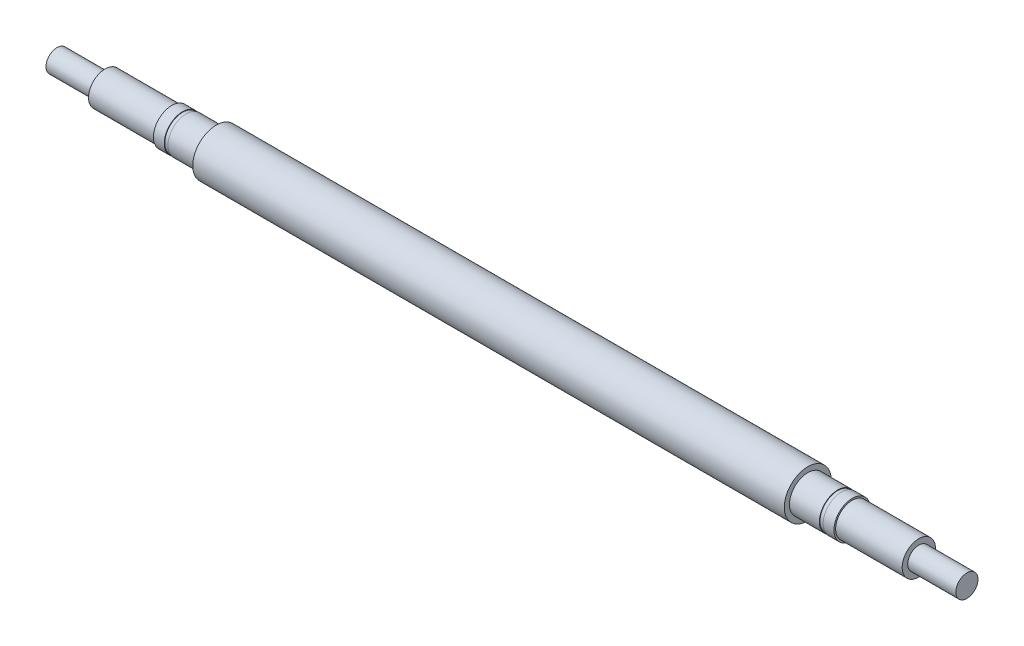
ISO-10303-21;
HEADER;
FILE_DESCRIPTION(('STEP AP214'),'2;1');
FILE_NAME('part.step','',(''),(''),'','','');
FILE_SCHEMA(('AUTOMOTIVE_DESIGN { 1 0 10303 214 1 1 1 1 }'));
ENDSEC;
DATA;
#1=APPLICATION_CONTEXT('core data for automotive mechanical design processes');
#2=APPLICATION_PROTOCOL_DEFINITION('international standard','automotive_design',2000,#1);
#3=PRODUCT_CONTEXT('',#1,'mechanical');
#4=PRODUCT('Part','Part','',(#3));
#5=PRODUCT_RELATED_PRODUCT_CATEGORY('part','',(#4));
#6=PRODUCT_DEFINITION_FORMATION('','',#4);
#7=PRODUCT_DEFINITION_CONTEXT('part definition',#1,'design');
#8=PRODUCT_DEFINITION('design','',#6,#7);
#9=PRODUCT_DEFINITION_SHAPE('','',#8);
#10=(LENGTH_UNIT() NAMED_UNIT(*) SI_UNIT(.MILLI.,.METRE.));
#11=(NAMED_UNIT(*) PLANE_ANGLE_UNIT() SI_UNIT($,.RADIAN.));
#12=(NAMED_UNIT(*) SI_UNIT($,.STERADIAN.) SOLID_ANGLE_UNIT());
#13=UNCERTAINTY_MEASURE_WITH_UNIT(LENGTH_MEASURE(1.E-05),#10,'distance_accuracy_value','');
#14=(GEOMETRIC_REPRESENTATION_CONTEXT(3) GLOBAL_UNCERTAINTY_ASSIGNED_CONTEXT((#13)) GLOBAL_UNIT_ASSIGNED_CONTEXT((#10,
#11,#12)) REPRESENTATION_CONTEXT('',''));
#15=CARTESIAN_POINT('',(0.,0.,0.));
#16=DIRECTION('',(0.,0.,1.));
#17=DIRECTION('',(1.,0.,0.));
#18=AXIS2_PLACEMENT_3D('',#15,#16,#17);
#19=CARTESIAN_POINT('',(123.,0.,-0.0536848982931916));
#20=DIRECTION('',(1.,0.,0.));
#21=DIRECTION('',(0.,0.,-1.));
#22=AXIS2_PLACEMENT_3D('',#19,#20,#21);
#23=CYLINDRICAL_SURFACE('',#22,6.35);
#24=CARTESIAN_POINT('',(-79.976146667179,0.,-0.0536848982931916));
#25=DIRECTION('',(1.,0.,0.));
#26=DIRECTION('',(0.,0.,-1.));
#27=AXIS2_PLACEMENT_3D('',#24,#25,#26);
#28=CIRCLE('',#27,6.35);
#29=CARTESIAN_POINT('',(-79.976146667179,0.,-6.4036848982932));
#30=VERTEX_POINT('',#29);
#31=EDGE_CURVE('E126',#30,#30,#28,.T.);
#32=ORIENTED_EDGE('',*,*,#31,.T.);
#33=EDGE_LOOP('',(#32));
#34=FACE_BOUND('',#33,.T.);
#35=CARTESIAN_POINT('',(79.976146667179,0.,-0.0536848982931916));
#36=DIRECTION('',(1.,0.,0.));
#37=DIRECTION('',(0.,0.,-1.));
#38=AXIS2_PLACEMENT_3D('',#35,#36,#37);
#39=CIRCLE('',#38,6.35);
#40=CARTESIAN_POINT('',(79.976146667179,0.,-6.4036848982932));
#41=VERTEX_POINT('',#40);
#42=EDGE_CURVE('E130',#41,#41,#39,.T.);
#43=ORIENTED_EDGE('',*,*,#42,.F.);
#44=EDGE_LOOP('',(#43));
#45=FACE_BOUND('',#44,.T.);
#46=CARTESIAN_POINT('',(-20.6548637464778,0.,-0.0536848982931916));
#47=DIRECTION('',(1.,0.,0.));
#48=DIRECTION('',(0.,0.,-1.));
#49=AXIS2_PLACEMENT_3D('',#46,#47,#48);
#50=CIRCLE('',#49,6.35);
#51=CARTESIAN_POINT('',(-20.6548637464778,3.50307669676708,-5.35));
#52=VERTEX_POINT('',#51);
#53=CARTESIAN_POINT('',(-20.6548637464778,-3.50307669676708,-5.35));
#54=VERTEX_POINT('',#53);
#55=EDGE_CURVE('E11',#52,#54,#50,.F.);
#56=ORIENTED_EDGE('',*,*,#55,.T.);
#57=DIRECTION('',(1.,0.,0.));
#58=VECTOR('',#57,1.);
#59=CARTESIAN_POINT('',(123.,-3.50307669676707,-5.35));
#60=LINE('',#59,#58);
#61=CARTESIAN_POINT('',(-10.6548637464778,-3.50307669676707,-5.35));
#62=VERTEX_POINT('',#61);
#63=EDGE_CURVE('E72',#54,#62,#60,.T.);
#64=ORIENTED_EDGE('',*,*,#63,.T.);
#65=CARTESIAN_POINT('',(-10.6548637464778,0.,-0.0536848982931916));
#66=DIRECTION('',(-1.,0.,0.));
#67=DIRECTION('',(0.,0.,1.));
#68=AXIS2_PLACEMENT_3D('',#65,#66,#67);
#69=CIRCLE('',#68,6.35);
#70=CARTESIAN_POINT('',(-10.6548637464778,3.50307669676707,-5.35));
#71=VERTEX_POINT('',#70);
#72=EDGE_CURVE('E69',#62,#71,#69,.F.);
#73=ORIENTED_EDGE('',*,*,#72,.T.);
#74=DIRECTION('',(1.,0.,0.));
#75=VECTOR('',#74,1.);
#76=CARTESIAN_POINT('',(123.,3.50307669676707,-5.35));
#77=LINE('',#76,#75);
#78=EDGE_CURVE('E51',#71,#52,#77,.F.);
#79=ORIENTED_EDGE('',*,*,#78,.T.);
#80=EDGE_LOOP('',(#56,#64,#73,#79));
#81=FACE_BOUND('',#80,.T.);
#82=ADVANCED_FACE('F42',(#34,#45,#81),#23,.T.);
#83=CARTESIAN_POINT('',(-123.,0.,-3.05368489829319));
#84=DIRECTION('',(-1.,0.,0.));
#85=DIRECTION('',(0.,0.,1.));
#86=AXIS2_PLACEMENT_3D('',#83,#84,#85);
#87=PLANE('',#86);
#88=CARTESIAN_POINT('',(-123.,0.,-0.0536848982931916));
#89=DIRECTION('',(1.,0.,0.));
#90=DIRECTION('',(0.,0.,-1.));
#91=AXIS2_PLACEMENT_3D('',#88,#89,#90);
#92=CIRCLE('',#91,3.);
#93=CARTESIAN_POINT('',(-123.,0.,-3.05368489829319));
#94=VERTEX_POINT('',#93);
#95=EDGE_CURVE('E73',#94,#94,#92,.T.);
#96=ORIENTED_EDGE('',*,*,#95,.F.);
#97=EDGE_LOOP('',(#96));
#98=FACE_BOUND('',#97,.T.);
#99=ADVANCED_FACE('F44',(#98),#87,.T.);
#100=CARTESIAN_POINT('',(123.,0.,-0.0536848982931916));
#101=DIRECTION('',(1.,0.,0.));
#102=DIRECTION('',(0.,0.,-1.));
#103=AXIS2_PLACEMENT_3D('',#100,#101,#102);
#104=CYLINDRICAL_SURFACE('',#103,3.);
#105=ORIENTED_EDGE('',*,*,#95,.T.);
#106=EDGE_LOOP('',(#105));
#107=FACE_BOUND('',#106,.T.);
#108=CARTESIAN_POINT('',(-110.,0.,-0.0536848982931916));
#109=DIRECTION('',(1.,0.,0.));
#110=DIRECTION('',(0.,0.,-1.));
#111=AXIS2_PLACEMENT_3D('',#108,#109,#110);
#112=CIRCLE('',#111,3.);
#113=CARTESIAN_POINT('',(-110.,0.,-3.05368489829319));
#114=VERTEX_POINT('',#113);
#115=EDGE_CURVE('E90',#114,#114,#112,.T.);
#116=ORIENTED_EDGE('',*,*,#115,.F.);
#117=EDGE_LOOP('',(#116));
#118=FACE_BOUND('',#117,.T.);
#119=ADVANCED_FACE('F195',(#107,#118),#104,.T.);
#120=CARTESIAN_POINT('',(-110.,0.,-4.55368489829319));
#121=DIRECTION('',(-1.,0.,0.));
#122=DIRECTION('',(0.,0.,1.));
#123=AXIS2_PLACEMENT_3D('',#120,#121,#122);
#124=PLANE('',#123);
#125=ORIENTED_EDGE('',*,*,#115,.T.);
#126=EDGE_LOOP('',(#125));
#127=FACE_BOUND('',#126,.T.);
#128=CARTESIAN_POINT('',(-110.,0.,-0.0536848982931916));
#129=DIRECTION('',(1.,0.,0.));
#130=DIRECTION('',(0.,0.,-1.));
#131=AXIS2_PLACEMENT_3D('',#128,#129,#130);
#132=CIRCLE('',#131,4.5);
#133=CARTESIAN_POINT('',(-110.,0.,-4.55368489829319));
#134=VERTEX_POINT('',#133);
#135=EDGE_CURVE('E94',#134,#134,#132,.T.);
#136=ORIENTED_EDGE('',*,*,#135,.F.);
#137=EDGE_LOOP('',(#136));
#138=FACE_BOUND('',#137,.T.);
#139=ADVANCED_FACE('F233',(#127,#138),#124,.T.);
#140=CARTESIAN_POINT('',(123.,0.,-0.0536848982931916));
#141=DIRECTION('',(1.,0.,0.));
#142=DIRECTION('',(0.,0.,-1.));
#143=AXIS2_PLACEMENT_3D('',#140,#141,#142);
#144=CYLINDRICAL_SURFACE('',#143,4.5);
#145=ORIENTED_EDGE('',*,*,#135,.T.);
#146=EDGE_LOOP('',(#145));
#147=FACE_BOUND('',#146,.T.);
#148=CARTESIAN_POINT('',(-92.,0.,-0.0536848982931916));
#149=DIRECTION('',(1.,0.,0.));
#150=DIRECTION('',(0.,0.,-1.));
#151=AXIS2_PLACEMENT_3D('',#148,#149,#150);
#152=CIRCLE('',#151,4.5);
#153=CARTESIAN_POINT('',(-92.,0.,-4.55368489829319));
#154=VERTEX_POINT('',#153);
#155=EDGE_CURVE('E98',#154,#154,#152,.T.);
#156=ORIENTED_EDGE('',*,*,#155,.F.);
#157=EDGE_LOOP('',(#156));
#158=FACE_BOUND('',#157,.T.);
#159=ADVANCED_FACE('F229',(#147,#158),#144,.T.);
#160=CARTESIAN_POINT('',(-92.,0.,-5.0036848982932));
#161=DIRECTION('',(-1.,0.,0.));
#162=DIRECTION('',(0.,0.,1.));
#163=AXIS2_PLACEMENT_3D('',#160,#161,#162);
#164=PLANE('',#163);
#165=ORIENTED_EDGE('',*,*,#155,.T.);
#166=EDGE_LOOP('',(#165));
#167=FACE_BOUND('',#166,.T.);
#168=CARTESIAN_POINT('',(-92.,0.,-0.0536848982931916));
#169=DIRECTION('',(1.,0.,0.));
#170=DIRECTION('',(0.,0.,-1.));
#171=AXIS2_PLACEMENT_3D('',#168,#169,#170);
#172=CIRCLE('',#171,4.95000000000001);
#173=CARTESIAN_POINT('',(-92.,0.,-5.0036848982932));
#174=VERTEX_POINT('',#173);
#175=EDGE_CURVE('E102',#174,#174,#172,.T.);
#176=ORIENTED_EDGE('',*,*,#175,.F.);
#177=EDGE_LOOP('',(#176));
#178=FACE_BOUND('',#177,.T.);
#179=ADVANCED_FACE('F225',(#167,#178),#164,.T.);
#180=CARTESIAN_POINT('',(123.,0.,-0.0536848982931916));
#181=DIRECTION('',(1.,0.,0.));
#182=DIRECTION('',(0.,0.,-1.));
#183=AXIS2_PLACEMENT_3D('',#180,#181,#182);
#184=CYLINDRICAL_SURFACE('',#183,4.95000000000001);
#185=ORIENTED_EDGE('',*,*,#175,.T.);
#186=EDGE_LOOP('',(#185));
#187=FACE_BOUND('',#186,.T.);
#188=CARTESIAN_POINT('',(-89.0761466671789,0.,-0.0536848982931916));
#189=DIRECTION('',(1.,0.,0.));
#190=DIRECTION('',(0.,0.,-1.));
#191=AXIS2_PLACEMENT_3D('',#188,#189,#190);
#192=CIRCLE('',#191,4.95000000000001);
#193=CARTESIAN_POINT('',(-89.0761466671789,0.,-5.0036848982932));
#194=VERTEX_POINT('',#193);
#195=EDGE_CURVE('E106',#194,#194,#192,.T.);
#196=ORIENTED_EDGE('',*,*,#195,.F.);
#197=EDGE_LOOP('',(#196));
#198=FACE_BOUND('',#197,.T.);
#199=ADVANCED_FACE('F221',(#187,#198),#184,.T.);
#200=CARTESIAN_POINT('',(-89.076146667179,0.,-4.85368489829317));
#201=DIRECTION('',(1.,0.,0.));
#202=DIRECTION('',(0.,0.,-1.));
#203=AXIS2_PLACEMENT_3D('',#200,#201,#202);
#204=PLANE('',#203);
#205=ORIENTED_EDGE('',*,*,#195,.T.);
#206=EDGE_LOOP('',(#205));
#207=FACE_BOUND('',#206,.T.);
#208=CARTESIAN_POINT('',(-89.0761466671789,0.,-0.0536848982931916));
#209=DIRECTION('',(1.,0.,0.));
#210=DIRECTION('',(0.,0.,-1.));
#211=AXIS2_PLACEMENT_3D('',#208,#209,#210);
#212=CIRCLE('',#211,4.79999999999998);
#213=CARTESIAN_POINT('',(-89.0761466671789,0.,-4.85368489829317));
#214=VERTEX_POINT('',#213);
#215=EDGE_CURVE('E110',#214,#214,#212,.T.);
#216=ORIENTED_EDGE('',*,*,#215,.F.);
#217=EDGE_LOOP('',(#216));
#218=FACE_BOUND('',#217,.T.);
#219=ADVANCED_FACE('F217',(#207,#218),#204,.T.);
#220=CARTESIAN_POINT('',(123.,0.,-0.0536848982931916));
#221=DIRECTION('',(1.,0.,0.));
#222=DIRECTION('',(0.,0.,-1.));
#223=AXIS2_PLACEMENT_3D('',#220,#221,#222);
#224=CYLINDRICAL_SURFACE('',#223,4.79999999999998);
#225=ORIENTED_EDGE('',*,*,#215,.T.);
#226=EDGE_LOOP('',(#225));
#227=FACE_BOUND('',#226,.T.);
#228=CARTESIAN_POINT('',(-88.0761466671789,0.,-0.0536848982931916));
#229=DIRECTION('',(1.,0.,0.));
#230=DIRECTION('',(0.,0.,-1.));
#231=AXIS2_PLACEMENT_3D('',#228,#229,#230);
#232=CIRCLE('',#231,4.79999999999998);
#233=CARTESIAN_POINT('',(-88.0761466671789,0.,-4.85368489829317));
#234=VERTEX_POINT('',#233);
#235=EDGE_CURVE('E114',#234,#234,#232,.T.);
#236=ORIENTED_EDGE('',*,*,#235,.F.);
#237=EDGE_LOOP('',(#236));
#238=FACE_BOUND('',#237,.T.);
#239=ADVANCED_FACE('F213',(#227,#238),#224,.T.);
#240=CARTESIAN_POINT('',(-88.076146667179,0.,-5.0036848982932));
#241=DIRECTION('',(-1.,0.,0.));
#242=DIRECTION('',(0.,0.,1.));
#243=AXIS2_PLACEMENT_3D('',#240,#241,#242);
#244=PLANE('',#243);
#245=ORIENTED_EDGE('',*,*,#235,.T.);
#246=EDGE_LOOP('',(#245));
#247=FACE_BOUND('',#246,.T.);
#248=CARTESIAN_POINT('',(-88.0761466671789,0.,-0.0536848982931916));
#249=DIRECTION('',(1.,0.,0.));
#250=DIRECTION('',(0.,0.,-1.));
#251=AXIS2_PLACEMENT_3D('',#248,#249,#250);
#252=CIRCLE('',#251,4.95000000000001);
#253=CARTESIAN_POINT('',(-88.0761466671789,0.,-5.0036848982932));
#254=VERTEX_POINT('',#253);
#255=EDGE_CURVE('E118',#254,#254,#252,.T.);
#256=ORIENTED_EDGE('',*,*,#255,.F.);
#257=EDGE_LOOP('',(#256));
#258=FACE_BOUND('',#257,.T.);
#259=ADVANCED_FACE('F209',(#247,#258),#244,.T.);
#260=CARTESIAN_POINT('',(123.,0.,-0.0536848982931916));
#261=DIRECTION('',(1.,0.,0.));
#262=DIRECTION('',(0.,0.,-1.));
#263=AXIS2_PLACEMENT_3D('',#260,#261,#262);
#264=CYLINDRICAL_SURFACE('',#263,4.95);
#265=ORIENTED_EDGE('',*,*,#255,.T.);
#266=EDGE_LOOP('',(#265));
#267=FACE_BOUND('',#266,.T.);
#268=CARTESIAN_POINT('',(-79.976146667179,0.,-0.0536848982931916));
#269=DIRECTION('',(1.,0.,0.));
#270=DIRECTION('',(0.,0.,-1.));
#271=AXIS2_PLACEMENT_3D('',#268,#269,#270);
#272=CIRCLE('',#271,4.95);
#273=CARTESIAN_POINT('',(-79.976146667179,0.,-5.0036848982932));
#274=VERTEX_POINT('',#273);
#275=EDGE_CURVE('E122',#274,#274,#272,.T.);
#276=ORIENTED_EDGE('',*,*,#275,.F.);
#277=EDGE_LOOP('',(#276));
#278=FACE_BOUND('',#277,.T.);
#279=ADVANCED_FACE('F205',(#267,#278),#264,.T.);
#280=CARTESIAN_POINT('',(-79.976146667179,0.,-6.4036848982932));
#281=DIRECTION('',(-1.,0.,0.));
#282=DIRECTION('',(0.,0.,1.));
#283=AXIS2_PLACEMENT_3D('',#280,#281,#282);
#284=PLANE('',#283);
#285=ORIENTED_EDGE('',*,*,#275,.T.);
#286=EDGE_LOOP('',(#285));
#287=FACE_BOUND('',#286,.T.);
#288=ORIENTED_EDGE('',*,*,#31,.F.);
#289=EDGE_LOOP('',(#288));
#290=FACE_BOUND('',#289,.T.);
#291=ADVANCED_FACE('F202',(#287,#290),#284,.T.);
#292=CARTESIAN_POINT('',(79.976146667179,0.,-6.4036848982932));
#293=DIRECTION('',(1.,0.,0.));
#294=DIRECTION('',(0.,0.,-1.));
#295=AXIS2_PLACEMENT_3D('',#292,#293,#294);
#296=PLANE('',#295);
#297=ORIENTED_EDGE('',*,*,#42,.T.);
#298=EDGE_LOOP('',(#297));
#299=FACE_BOUND('',#298,.T.);
#300=CARTESIAN_POINT('',(79.976146667179,0.,-0.0536848982931916));
#301=DIRECTION('',(1.,0.,0.));
#302=DIRECTION('',(0.,0.,-1.));
#303=AXIS2_PLACEMENT_3D('',#300,#301,#302);
#304=CIRCLE('',#303,4.95);
#305=CARTESIAN_POINT('',(79.976146667179,0.,-5.0036848982932));
#306=VERTEX_POINT('',#305);
#307=EDGE_CURVE('E134',#306,#306,#304,.T.);
#308=ORIENTED_EDGE('',*,*,#307,.F.);
#309=EDGE_LOOP('',(#308));
#310=FACE_BOUND('',#309,.T.);
#311=ADVANCED_FACE('F200',(#299,#310),#296,.T.);
#312=CARTESIAN_POINT('',(123.,0.,-0.0536848982931916));
#313=DIRECTION('',(1.,0.,0.));
#314=DIRECTION('',(0.,0.,-1.));
#315=AXIS2_PLACEMENT_3D('',#312,#313,#314);
#316=CYLINDRICAL_SURFACE('',#315,4.95);
#317=ORIENTED_EDGE('',*,*,#307,.T.);
#318=EDGE_LOOP('',(#317));
#319=FACE_BOUND('',#318,.T.);
#320=CARTESIAN_POINT('',(88.076146667179,0.,-0.0536848982931916));
#321=DIRECTION('',(1.,0.,0.));
#322=DIRECTION('',(0.,0.,-1.));
#323=AXIS2_PLACEMENT_3D('',#320,#321,#322);
#324=CIRCLE('',#323,4.95000000000001);
#325=CARTESIAN_POINT('',(88.076146667179,0.,-5.0036848982932));
#326=VERTEX_POINT('',#325);
#327=EDGE_CURVE('E138',#326,#326,#324,.T.);
#328=ORIENTED_EDGE('',*,*,#327,.F.);
#329=EDGE_LOOP('',(#328));
#330=FACE_BOUND('',#329,.T.);
#331=ADVANCED_FACE('F306',(#319,#330),#316,.T.);
#332=CARTESIAN_POINT('',(88.076146667179,0.,-5.0036848982932));
#333=DIRECTION('',(1.,0.,0.));
#334=DIRECTION('',(0.,0.,-1.));
#335=AXIS2_PLACEMENT_3D('',#332,#333,#334);
#336=PLANE('',#335);
#337=ORIENTED_EDGE('',*,*,#327,.T.);
#338=EDGE_LOOP('',(#337));
#339=FACE_BOUND('',#338,.T.);
#340=CARTESIAN_POINT('',(88.076146667179,0.,-0.0536848982931916));
#341=DIRECTION('',(1.,0.,0.));
#342=DIRECTION('',(0.,0.,-1.));
#343=AXIS2_PLACEMENT_3D('',#340,#341,#342);
#344=CIRCLE('',#343,4.79999999999998);
#345=CARTESIAN_POINT('',(88.076146667179,0.,-4.85368489829317));
#346=VERTEX_POINT('',#345);
#347=EDGE_CURVE('E142',#346,#346,#344,.T.);
#348=ORIENTED_EDGE('',*,*,#347,.F.);
#349=EDGE_LOOP('',(#348));
#350=FACE_BOUND('',#349,.T.);
#351=ADVANCED_FACE('F313',(#339,#350),#336,.T.);
#352=CARTESIAN_POINT('',(123.,0.,-0.0536848982931916));
#353=DIRECTION('',(1.,0.,0.));
#354=DIRECTION('',(0.,0.,-1.));
#355=AXIS2_PLACEMENT_3D('',#352,#353,#354);
#356=CYLINDRICAL_SURFACE('',#355,4.79999999999998);
#357=ORIENTED_EDGE('',*,*,#347,.T.);
#358=EDGE_LOOP('',(#357));
#359=FACE_BOUND('',#358,.T.);
#360=CARTESIAN_POINT('',(89.076146667179,0.,-0.0536848982931916));
#361=DIRECTION('',(1.,0.,0.));
#362=DIRECTION('',(0.,0.,-1.));
#363=AXIS2_PLACEMENT_3D('',#360,#361,#362);
#364=CIRCLE('',#363,4.79999999999998);
#365=CARTESIAN_POINT('',(89.076146667179,0.,-4.85368489829317));
#366=VERTEX_POINT('',#365);
#367=EDGE_CURVE('E146',#366,#366,#364,.T.);
#368=ORIENTED_EDGE('',*,*,#367,.F.);
#369=EDGE_LOOP('',(#368));
#370=FACE_BOUND('',#369,.T.);
#371=ADVANCED_FACE('F320',(#359,#370),#356,.T.);
#372=CARTESIAN_POINT('',(89.076146667179,0.,-4.85368489829317));
#373=DIRECTION('',(-1.,0.,0.));
#374=DIRECTION('',(0.,0.,1.));
#375=AXIS2_PLACEMENT_3D('',#372,#373,#374);
#376=PLANE('',#375);
#377=ORIENTED_EDGE('',*,*,#367,.T.);
#378=EDGE_LOOP('',(#377));
#379=FACE_BOUND('',#378,.T.);
#380=CARTESIAN_POINT('',(89.076146667179,0.,-0.0536848982931916));
#381=DIRECTION('',(1.,0.,0.));
#382=DIRECTION('',(0.,0.,-1.));
#383=AXIS2_PLACEMENT_3D('',#380,#381,#382);
#384=CIRCLE('',#383,4.95000000000001);
#385=CARTESIAN_POINT('',(89.076146667179,0.,-5.0036848982932));
#386=VERTEX_POINT('',#385);
#387=EDGE_CURVE('E150',#386,#386,#384,.T.);
#388=ORIENTED_EDGE('',*,*,#387,.F.);
#389=EDGE_LOOP('',(#388));
#390=FACE_BOUND('',#389,.T.);
#391=ADVANCED_FACE('F328',(#379,#390),#376,.T.);
#392=CARTESIAN_POINT('',(123.,0.,-0.0536848982931916));
#393=DIRECTION('',(1.,0.,0.));
#394=DIRECTION('',(0.,0.,-1.));
#395=AXIS2_PLACEMENT_3D('',#392,#393,#394);
#396=CYLINDRICAL_SURFACE('',#395,4.95000000000001);
#397=ORIENTED_EDGE('',*,*,#387,.T.);
#398=EDGE_LOOP('',(#397));
#399=FACE_BOUND('',#398,.T.);
#400=CARTESIAN_POINT('',(92.,0.,-0.0536848982931916));
#401=DIRECTION('',(1.,0.,0.));
#402=DIRECTION('',(0.,0.,-1.));
#403=AXIS2_PLACEMENT_3D('',#400,#401,#402);
#404=CIRCLE('',#403,4.95000000000001);
#405=CARTESIAN_POINT('',(92.,0.,-5.0036848982932));
#406=VERTEX_POINT('',#405);
#407=EDGE_CURVE('E154',#406,#406,#404,.T.);
#408=ORIENTED_EDGE('',*,*,#407,.F.);
#409=EDGE_LOOP('',(#408));
#410=FACE_BOUND('',#409,.T.);
#411=ADVANCED_FACE('F336',(#399,#410),#396,.T.);
#412=CARTESIAN_POINT('',(92.,0.,-5.0036848982932));
#413=DIRECTION('',(1.,0.,0.));
#414=DIRECTION('',(0.,0.,-1.));
#415=AXIS2_PLACEMENT_3D('',#412,#413,#414);
#416=PLANE('',#415);
#417=ORIENTED_EDGE('',*,*,#407,.T.);
#418=EDGE_LOOP('',(#417));
#419=FACE_BOUND('',#418,.T.);
#420=CARTESIAN_POINT('',(92.,0.,-0.0536848982931916));
#421=DIRECTION('',(1.,0.,0.));
#422=DIRECTION('',(0.,0.,-1.));
#423=AXIS2_PLACEMENT_3D('',#420,#421,#422);
#424=CIRCLE('',#423,4.5);
#425=CARTESIAN_POINT('',(92.,0.,-4.55368489829319));
#426=VERTEX_POINT('',#425);
#427=EDGE_CURVE('E158',#426,#426,#424,.T.);
#428=ORIENTED_EDGE('',*,*,#427,.F.);
#429=EDGE_LOOP('',(#428));
#430=FACE_BOUND('',#429,.T.);
#431=ADVANCED_FACE('F344',(#419,#430),#416,.T.);
#432=CARTESIAN_POINT('',(123.,0.,-0.0536848982931916));
#433=DIRECTION('',(1.,0.,0.));
#434=DIRECTION('',(0.,0.,-1.));
#435=AXIS2_PLACEMENT_3D('',#432,#433,#434);
#436=CYLINDRICAL_SURFACE('',#435,4.5);
#437=ORIENTED_EDGE('',*,*,#427,.T.);
#438=EDGE_LOOP('',(#437));
#439=FACE_BOUND('',#438,.T.);
#440=CARTESIAN_POINT('',(110.,0.,-0.0536848982931916));
#441=DIRECTION('',(1.,0.,0.));
#442=DIRECTION('',(0.,0.,-1.));
#443=AXIS2_PLACEMENT_3D('',#440,#441,#442);
#444=CIRCLE('',#443,4.5);
#445=CARTESIAN_POINT('',(110.,0.,-4.55368489829319));
#446=VERTEX_POINT('',#445);
#447=EDGE_CURVE('E162',#446,#446,#444,.T.);
#448=ORIENTED_EDGE('',*,*,#447,.F.);
#449=EDGE_LOOP('',(#448));
#450=FACE_BOUND('',#449,.T.);
#451=ADVANCED_FACE('F352',(#439,#450),#436,.T.);
#452=CARTESIAN_POINT('',(110.,0.,-4.55368489829319));
#453=DIRECTION('',(1.,0.,0.));
#454=DIRECTION('',(0.,0.,-1.));
#455=AXIS2_PLACEMENT_3D('',#452,#453,#454);
#456=PLANE('',#455);
#457=ORIENTED_EDGE('',*,*,#447,.T.);
#458=EDGE_LOOP('',(#457));
#459=FACE_BOUND('',#458,.T.);
#460=CARTESIAN_POINT('',(110.,0.,-0.0536848982931916));
#461=DIRECTION('',(1.,0.,0.));
#462=DIRECTION('',(0.,0.,-1.));
#463=AXIS2_PLACEMENT_3D('',#460,#461,#462);
#464=CIRCLE('',#463,3.);
#465=CARTESIAN_POINT('',(110.,0.,-3.05368489829319));
#466=VERTEX_POINT('',#465);
#467=EDGE_CURVE('E166',#466,#466,#464,.T.);
#468=ORIENTED_EDGE('',*,*,#467,.F.);
#469=EDGE_LOOP('',(#468));
#470=FACE_BOUND('',#469,.T.);
#471=ADVANCED_FACE('F360',(#459,#470),#456,.T.);
#472=CARTESIAN_POINT('',(123.,0.,-0.0536848982931916));
#473=DIRECTION('',(1.,0.,0.));
#474=DIRECTION('',(0.,0.,-1.));
#475=AXIS2_PLACEMENT_3D('',#472,#473,#474);
#476=CYLINDRICAL_SURFACE('',#475,3.);
#477=ORIENTED_EDGE('',*,*,#467,.T.);
#478=EDGE_LOOP('',(#477));
#479=FACE_BOUND('',#478,.T.);
#480=CARTESIAN_POINT('',(123.,0.,-0.0536848982931916));
#481=DIRECTION('',(1.,0.,0.));
#482=DIRECTION('',(0.,0.,-1.));
#483=AXIS2_PLACEMENT_3D('',#480,#481,#482);
#484=CIRCLE('',#483,3.);
#485=CARTESIAN_POINT('',(123.,0.,-3.05368489829319));
#486=VERTEX_POINT('',#485);
#487=EDGE_CURVE('E170',#486,#486,#484,.T.);
#488=ORIENTED_EDGE('',*,*,#487,.F.);
#489=EDGE_LOOP('',(#488));
#490=FACE_BOUND('',#489,.T.);
#491=ADVANCED_FACE('F186',(#479,#490),#476,.T.);
#492=CARTESIAN_POINT('',(123.,0.,-3.05368489829319));
#493=DIRECTION('',(1.,0.,0.));
#494=DIRECTION('',(0.,0.,-1.));
#495=AXIS2_PLACEMENT_3D('',#492,#493,#494);
#496=PLANE('',#495);
#497=ORIENTED_EDGE('',*,*,#487,.T.);
#498=EDGE_LOOP('',(#497));
#499=FACE_BOUND('',#498,.T.);
#500=ADVANCED_FACE('F179',(#499),#496,.T.);
#501=CARTESIAN_POINT('',(-20.6548637464778,308.318473741033,-5.35));
#502=DIRECTION('',(1.,0.,0.));
#503=DIRECTION('',(0.,0.,-1.));
#504=AXIS2_PLACEMENT_3D('',#501,#502,#503);
#505=PLANE('',#504);
#506=DIRECTION('',(0.,-1.,0.));
#507=VECTOR('',#506,1.);
#508=CARTESIAN_POINT('',(-20.6548637464778,308.318473741033,-5.35));
#509=LINE('',#508,#507);
#510=EDGE_CURVE('E80',#52,#54,#509,.T.);
#511=ORIENTED_EDGE('',*,*,#510,.T.);
#512=ORIENTED_EDGE('',*,*,#55,.F.);
#513=EDGE_LOOP('',(#511,#512));
#514=FACE_BOUND('',#513,.T.);
#515=ADVANCED_FACE('F177',(#514),#505,.T.);
#516=CARTESIAN_POINT('',(-10.6548637464778,308.318473741033,-5.35));
#517=DIRECTION('',(0.,0.,-1.));
#518=DIRECTION('',(-1.,0.,0.));
#519=AXIS2_PLACEMENT_3D('',#516,#517,#518);
#520=PLANE('',#519);
#521=ORIENTED_EDGE('',*,*,#78,.F.);
#522=DIRECTION('',(0.,-1.,0.));
#523=VECTOR('',#522,1.);
#524=CARTESIAN_POINT('',(-10.6548637464778,308.318473741033,-5.35));
#525=LINE('',#524,#523);
#526=EDGE_CURVE('E57',#71,#62,#525,.T.);
#527=ORIENTED_EDGE('',*,*,#526,.T.);
#528=ORIENTED_EDGE('',*,*,#63,.F.);
#529=ORIENTED_EDGE('',*,*,#510,.F.);
#530=EDGE_LOOP('',(#521,#527,#528,#529));
#531=FACE_BOUND('',#530,.T.);
#532=ADVANCED_FACE('F76',(#531),#520,.T.);
#533=CARTESIAN_POINT('',(-10.6548637464778,308.318473741033,-5.35));
#534=DIRECTION('',(-1.,0.,0.));
#535=DIRECTION('',(0.,0.,1.));
#536=AXIS2_PLACEMENT_3D('',#533,#534,#535);
#537=PLANE('',#536);
#538=ORIENTED_EDGE('',*,*,#72,.F.);
#539=ORIENTED_EDGE('',*,*,#526,.F.);
#540=EDGE_LOOP('',(#538,#539));
#541=FACE_BOUND('',#540,.T.);
#542=ADVANCED_FACE('F70',(#541),#537,.T.);
#543=CLOSED_SHELL('',(#82,#99,#119,#139,#159,#179,#199,#219,#239,#259,#279,#291,#311,#331,#351,
#371,#391,#411,#431,#451,#471,#491,#500,#515,#532,#542));
#544=MANIFOLD_SOLID_BREP('B2',#543);
#545=ADVANCED_BREP_SHAPE_REPRESENTATION('',(#18,#544),#14);
#546=SHAPE_DEFINITION_REPRESENTATION(#9,#545);
ENDSEC;
END-ISO-10303-21;
